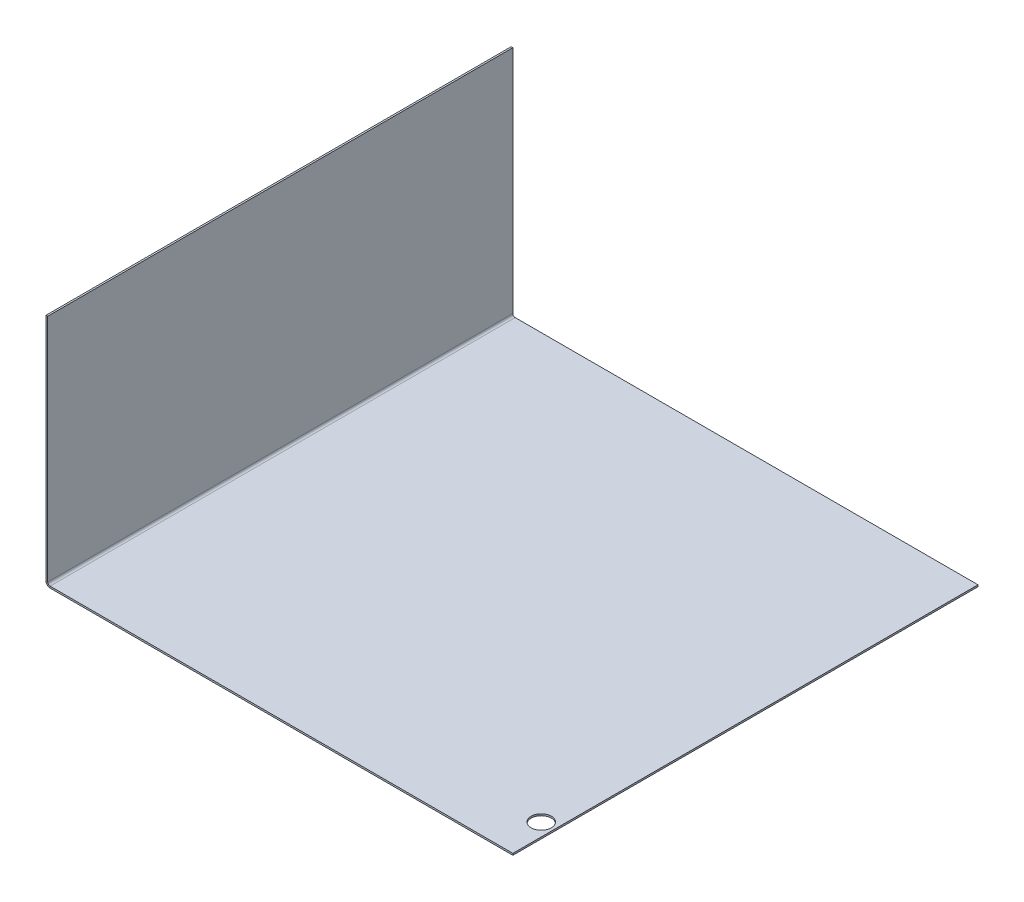
ISO-10303-21;
HEADER;
FILE_DESCRIPTION(('STEP AP214'),'2;1');
FILE_NAME('part.step','',(''),(''),'','','');
FILE_SCHEMA(('AUTOMOTIVE_DESIGN { 1 0 10303 214 1 1 1 1 }'));
ENDSEC;
DATA;
#1=APPLICATION_CONTEXT('core data for automotive mechanical design processes');
#2=APPLICATION_PROTOCOL_DEFINITION('international standard','automotive_design',2000,#1);
#3=PRODUCT_CONTEXT('',#1,'mechanical');
#4=PRODUCT('Part','Part','',(#3));
#5=PRODUCT_RELATED_PRODUCT_CATEGORY('part','',(#4));
#6=PRODUCT_DEFINITION_FORMATION('','',#4);
#7=PRODUCT_DEFINITION_CONTEXT('part definition',#1,'design');
#8=PRODUCT_DEFINITION('design','',#6,#7);
#9=PRODUCT_DEFINITION_SHAPE('','',#8);
#10=(LENGTH_UNIT() NAMED_UNIT(*) SI_UNIT(.MILLI.,.METRE.));
#11=(NAMED_UNIT(*) PLANE_ANGLE_UNIT() SI_UNIT($,.RADIAN.));
#12=(NAMED_UNIT(*) SI_UNIT($,.STERADIAN.) SOLID_ANGLE_UNIT());
#13=UNCERTAINTY_MEASURE_WITH_UNIT(LENGTH_MEASURE(1.E-05),#10,'distance_accuracy_value','');
#14=(GEOMETRIC_REPRESENTATION_CONTEXT(3) GLOBAL_UNCERTAINTY_ASSIGNED_CONTEXT((#13)) GLOBAL_UNIT_ASSIGNED_CONTEXT((#10,
#11,#12)) REPRESENTATION_CONTEXT('',''));
#15=CARTESIAN_POINT('',(0.,0.,0.));
#16=DIRECTION('',(0.,0.,1.));
#17=DIRECTION('',(1.,0.,0.));
#18=AXIS2_PLACEMENT_3D('',#15,#16,#17);
#19=CARTESIAN_POINT('',(1.,0.,100.));
#20=DIRECTION('',(0.,0.,1.));
#21=DIRECTION('',(1.,0.,0.));
#22=AXIS2_PLACEMENT_3D('',#19,#20,#21);
#23=PLANE('',#22);
#24=DIRECTION('',(0.,-1.,0.));
#25=VECTOR('',#24,1.);
#26=CARTESIAN_POINT('',(1.,0.,100.));
#27=LINE('',#26,#25);
#28=CARTESIAN_POINT('',(1.,0.,100.));
#29=VERTEX_POINT('',#28);
#30=CARTESIAN_POINT('',(1.,-0.7366,100.));
#31=VERTEX_POINT('',#30);
#32=EDGE_CURVE('E11',#29,#31,#27,.T.);
#33=ORIENTED_EDGE('',*,*,#32,.F.);
#34=CARTESIAN_POINT('',(1.,1.,100.));
#35=DIRECTION('',(0.,0.,-1.));
#36=DIRECTION('',(-1.,0.,0.));
#37=AXIS2_PLACEMENT_3D('',#34,#35,#36);
#38=CIRCLE('',#37,1.);
#39=CARTESIAN_POINT('',(0.,1.,100.));
#40=VERTEX_POINT('',#39);
#41=EDGE_CURVE('E140',#40,#29,#38,.F.);
#42=ORIENTED_EDGE('',*,*,#41,.F.);
#43=DIRECTION('',(1.,0.,0.));
#44=VECTOR('',#43,1.);
#45=CARTESIAN_POINT('',(-0.7366,1.,100.));
#46=LINE('',#45,#44);
#47=CARTESIAN_POINT('',(-0.7366,1.,100.));
#48=VERTEX_POINT('',#47);
#49=EDGE_CURVE('E51',#48,#40,#46,.T.);
#50=ORIENTED_EDGE('',*,*,#49,.F.);
#51=CARTESIAN_POINT('',(1.,1.,100.));
#52=DIRECTION('',(0.,0.,1.));
#53=DIRECTION('',(1.,0.,0.));
#54=AXIS2_PLACEMENT_3D('',#51,#52,#53);
#55=CIRCLE('',#54,1.7366);
#56=EDGE_CURVE('E133',#48,#31,#55,.T.);
#57=ORIENTED_EDGE('',*,*,#56,.T.);
#58=EDGE_LOOP('',(#33,#42,#50,#57));
#59=FACE_BOUND('',#58,.T.);
#60=ADVANCED_FACE('F43',(#59),#23,.T.);
#61=CARTESIAN_POINT('',(-0.7366,1.,100.));
#62=DIRECTION('',(0.,0.,1.));
#63=DIRECTION('',(1.,0.,0.));
#64=AXIS2_PLACEMENT_3D('',#61,#62,#63);
#65=PLANE('',#64);
#66=DIRECTION('',(1.,0.,0.));
#67=VECTOR('',#66,1.);
#68=CARTESIAN_POINT('',(0.,0.,100.));
#69=LINE('',#68,#67);
#70=CARTESIAN_POINT('',(200.,0.,100.));
#71=VERTEX_POINT('',#70);
#72=EDGE_CURVE('E190',#29,#71,#69,.T.);
#73=ORIENTED_EDGE('',*,*,#72,.F.);
#74=ORIENTED_EDGE('',*,*,#32,.T.);
#75=DIRECTION('',(1.,0.,0.));
#76=VECTOR('',#75,1.);
#77=CARTESIAN_POINT('',(0.,-0.7366,100.));
#78=LINE('',#77,#76);
#79=CARTESIAN_POINT('',(200.,-0.7366,100.));
#80=VERTEX_POINT('',#79);
#81=EDGE_CURVE('E99',#31,#80,#78,.T.);
#82=ORIENTED_EDGE('',*,*,#81,.T.);
#83=DIRECTION('',(0.,-1.,0.));
#84=VECTOR('',#83,1.);
#85=CARTESIAN_POINT('',(200.,0.,100.));
#86=LINE('',#85,#84);
#87=EDGE_CURVE('E366',#71,#80,#86,.T.);
#88=ORIENTED_EDGE('',*,*,#87,.F.);
#89=EDGE_LOOP('',(#73,#74,#82,#88));
#90=FACE_BOUND('',#89,.T.);
#91=ADVANCED_FACE('F198',(#90),#65,.T.);
#92=CARTESIAN_POINT('',(0.,1.,-100.));
#93=DIRECTION('',(0.,0.,-1.));
#94=DIRECTION('',(-1.,0.,0.));
#95=AXIS2_PLACEMENT_3D('',#92,#93,#94);
#96=PLANE('',#95);
#97=DIRECTION('',(-1.,0.,0.));
#98=VECTOR('',#97,1.);
#99=CARTESIAN_POINT('',(0.,1.,-100.));
#100=LINE('',#99,#98);
#101=CARTESIAN_POINT('',(0.,1.,-100.));
#102=VERTEX_POINT('',#101);
#103=CARTESIAN_POINT('',(-0.7366,1.,-100.));
#104=VERTEX_POINT('',#103);
#105=EDGE_CURVE('E86',#102,#104,#100,.T.);
#106=ORIENTED_EDGE('',*,*,#105,.F.);
#107=CARTESIAN_POINT('',(1.,1.,-100.));
#108=DIRECTION('',(0.,0.,-1.));
#109=DIRECTION('',(-1.,0.,0.));
#110=AXIS2_PLACEMENT_3D('',#107,#108,#109);
#111=CIRCLE('',#110,1.);
#112=CARTESIAN_POINT('',(1.,0.,-100.));
#113=VERTEX_POINT('',#112);
#114=EDGE_CURVE('E156',#102,#113,#111,.F.);
#115=ORIENTED_EDGE('',*,*,#114,.T.);
#116=DIRECTION('',(0.,1.,0.));
#117=VECTOR('',#116,1.);
#118=CARTESIAN_POINT('',(1.,-0.7366,-100.));
#119=LINE('',#118,#117);
#120=CARTESIAN_POINT('',(1.,-0.7366,-100.));
#121=VERTEX_POINT('',#120);
#122=EDGE_CURVE('E93',#121,#113,#119,.T.);
#123=ORIENTED_EDGE('',*,*,#122,.F.);
#124=CARTESIAN_POINT('',(1.,1.,-100.));
#125=DIRECTION('',(0.,0.,1.));
#126=DIRECTION('',(1.,0.,0.));
#127=AXIS2_PLACEMENT_3D('',#124,#125,#126);
#128=CIRCLE('',#127,1.7366);
#129=EDGE_CURVE('E163',#104,#121,#128,.T.);
#130=ORIENTED_EDGE('',*,*,#129,.F.);
#131=EDGE_LOOP('',(#106,#115,#123,#130));
#132=FACE_BOUND('',#131,.T.);
#133=ADVANCED_FACE('F196',(#132),#96,.T.);
#134=CARTESIAN_POINT('',(1.,-0.7366,-100.));
#135=DIRECTION('',(0.,0.,-1.));
#136=DIRECTION('',(-1.,0.,0.));
#137=AXIS2_PLACEMENT_3D('',#134,#135,#136);
#138=PLANE('',#137);
#139=DIRECTION('',(0.,-1.,0.));
#140=VECTOR('',#139,1.);
#141=CARTESIAN_POINT('',(0.,100.,-100.));
#142=LINE('',#141,#140);
#143=CARTESIAN_POINT('',(0.,100.,-100.));
#144=VERTEX_POINT('',#143);
#145=EDGE_CURVE('E158',#144,#102,#142,.T.);
#146=ORIENTED_EDGE('',*,*,#145,.T.);
#147=ORIENTED_EDGE('',*,*,#105,.T.);
#148=DIRECTION('',(0.,1.,0.));
#149=VECTOR('',#148,1.);
#150=CARTESIAN_POINT('',(-0.7366,100.,-100.));
#151=LINE('',#150,#149);
#152=CARTESIAN_POINT('',(-0.7366,100.,-100.));
#153=VERTEX_POINT('',#152);
#154=EDGE_CURVE('E161',#153,#104,#151,.F.);
#155=ORIENTED_EDGE('',*,*,#154,.F.);
#156=DIRECTION('',(1.,0.,0.));
#157=VECTOR('',#156,1.);
#158=CARTESIAN_POINT('',(-0.7366,100.,-100.));
#159=LINE('',#158,#157);
#160=EDGE_CURVE('E121',#153,#144,#159,.T.);
#161=ORIENTED_EDGE('',*,*,#160,.T.);
#162=EDGE_LOOP('',(#146,#147,#155,#161));
#163=FACE_BOUND('',#162,.T.);
#164=ADVANCED_FACE('F192',(#163),#138,.T.);
#165=CARTESIAN_POINT('',(0.,-0.7366,100.));
#166=DIRECTION('',(0.,1.,0.));
#167=DIRECTION('',(0.,0.,1.));
#168=AXIS2_PLACEMENT_3D('',#165,#166,#167);
#169=PLANE('',#168);
#170=CARTESIAN_POINT('',(194.445286261705,-0.7366,82.2169240869359));
#171=DIRECTION('',(0.,1.,0.));
#172=DIRECTION('',(0.,0.,1.));
#173=AXIS2_PLACEMENT_3D('',#170,#171,#172);
#174=CIRCLE('',#173,4.33433537196366);
#175=CARTESIAN_POINT('',(194.445286261705,-0.7366,86.5512594588995));
#176=VERTEX_POINT('',#175);
#177=EDGE_CURVE('E150',#176,#176,#174,.T.);
#178=ORIENTED_EDGE('',*,*,#177,.T.);
#179=EDGE_LOOP('',(#178));
#180=FACE_BOUND('',#179,.T.);
#181=DIRECTION('',(1.,0.,0.));
#182=VECTOR('',#181,1.);
#183=CARTESIAN_POINT('',(0.,-0.7366,-100.));
#184=LINE('',#183,#182);
#185=CARTESIAN_POINT('',(200.,-0.7366,-100.));
#186=VERTEX_POINT('',#185);
#187=EDGE_CURVE('E146',#121,#186,#184,.T.);
#188=ORIENTED_EDGE('',*,*,#187,.T.);
#189=DIRECTION('',(0.,0.,-1.));
#190=VECTOR('',#189,1.);
#191=CARTESIAN_POINT('',(200.,-0.7366,100.));
#192=LINE('',#191,#190);
#193=EDGE_CURVE('E177',#80,#186,#192,.T.);
#194=ORIENTED_EDGE('',*,*,#193,.F.);
#195=ORIENTED_EDGE('',*,*,#81,.F.);
#196=DIRECTION('',(0.,0.,-1.));
#197=VECTOR('',#196,1.);
#198=CARTESIAN_POINT('',(1.,-0.7366,100.));
#199=LINE('',#198,#197);
#200=EDGE_CURVE('E145',#31,#121,#199,.T.);
#201=ORIENTED_EDGE('',*,*,#200,.T.);
#202=EDGE_LOOP('',(#188,#194,#195,#201));
#203=FACE_BOUND('',#202,.T.);
#204=ADVANCED_FACE('F204',(#180,#203),#169,.F.);
#205=CARTESIAN_POINT('',(200.,0.,100.));
#206=DIRECTION('',(1.,0.,0.));
#207=DIRECTION('',(0.,0.,-1.));
#208=AXIS2_PLACEMENT_3D('',#205,#206,#207);
#209=PLANE('',#208);
#210=DIRECTION('',(0.,-1.,0.));
#211=VECTOR('',#210,1.);
#212=CARTESIAN_POINT('',(200.,0.,-100.));
#213=LINE('',#212,#211);
#214=CARTESIAN_POINT('',(200.,0.,-100.));
#215=VERTEX_POINT('',#214);
#216=EDGE_CURVE('E149',#215,#186,#213,.T.);
#217=ORIENTED_EDGE('',*,*,#216,.F.);
#218=DIRECTION('',(0.,0.,-1.));
#219=VECTOR('',#218,1.);
#220=CARTESIAN_POINT('',(200.,0.,100.));
#221=LINE('',#220,#219);
#222=EDGE_CURVE('E175',#71,#215,#221,.T.);
#223=ORIENTED_EDGE('',*,*,#222,.F.);
#224=ORIENTED_EDGE('',*,*,#87,.T.);
#225=ORIENTED_EDGE('',*,*,#193,.T.);
#226=EDGE_LOOP('',(#217,#223,#224,#225));
#227=FACE_BOUND('',#226,.T.);
#228=ADVANCED_FACE('F238',(#227),#209,.T.);
#229=CARTESIAN_POINT('',(0.,0.,100.));
#230=DIRECTION('',(0.,1.,0.));
#231=DIRECTION('',(0.,0.,1.));
#232=AXIS2_PLACEMENT_3D('',#229,#230,#231);
#233=PLANE('',#232);
#234=CARTESIAN_POINT('',(194.445286261705,0.,82.2169240869359));
#235=DIRECTION('',(0.,1.,0.));
#236=DIRECTION('',(0.,0.,1.));
#237=AXIS2_PLACEMENT_3D('',#234,#235,#236);
#238=CIRCLE('',#237,4.33433537196366);
#239=CARTESIAN_POINT('',(194.445286261705,0.,86.5512594588995));
#240=VERTEX_POINT('',#239);
#241=EDGE_CURVE('E361',#240,#240,#238,.T.);
#242=ORIENTED_EDGE('',*,*,#241,.F.);
#243=EDGE_LOOP('',(#242));
#244=FACE_BOUND('',#243,.T.);
#245=DIRECTION('',(1.,0.,0.));
#246=VECTOR('',#245,1.);
#247=CARTESIAN_POINT('',(0.,0.,-100.));
#248=LINE('',#247,#246);
#249=EDGE_CURVE('E153',#113,#215,#248,.T.);
#250=ORIENTED_EDGE('',*,*,#249,.F.);
#251=DIRECTION('',(0.,0.,-1.));
#252=VECTOR('',#251,1.);
#253=CARTESIAN_POINT('',(1.,0.,100.));
#254=LINE('',#253,#252);
#255=EDGE_CURVE('E172',#29,#113,#254,.T.);
#256=ORIENTED_EDGE('',*,*,#255,.F.);
#257=ORIENTED_EDGE('',*,*,#72,.T.);
#258=ORIENTED_EDGE('',*,*,#222,.T.);
#259=EDGE_LOOP('',(#250,#256,#257,#258));
#260=FACE_BOUND('',#259,.T.);
#261=ADVANCED_FACE('F250',(#244,#260),#233,.T.);
#262=CARTESIAN_POINT('',(1.,1.,100.));
#263=DIRECTION('',(0.,0.,-1.));
#264=DIRECTION('',(-1.,0.,0.));
#265=AXIS2_PLACEMENT_3D('',#262,#263,#264);
#266=CYLINDRICAL_SURFACE('',#265,1.);
#267=ORIENTED_EDGE('',*,*,#114,.F.);
#268=DIRECTION('',(0.,0.,-1.));
#269=VECTOR('',#268,1.);
#270=CARTESIAN_POINT('',(0.,1.,100.));
#271=LINE('',#270,#269);
#272=EDGE_CURVE('E169',#40,#102,#271,.T.);
#273=ORIENTED_EDGE('',*,*,#272,.F.);
#274=ORIENTED_EDGE('',*,*,#41,.T.);
#275=ORIENTED_EDGE('',*,*,#255,.T.);
#276=EDGE_LOOP('',(#267,#273,#274,#275));
#277=FACE_BOUND('',#276,.T.);
#278=ADVANCED_FACE('F186',(#277),#266,.F.);
#279=CARTESIAN_POINT('',(0.,100.,100.));
#280=DIRECTION('',(1.,0.,0.));
#281=DIRECTION('',(0.,0.,-1.));
#282=AXIS2_PLACEMENT_3D('',#279,#280,#281);
#283=PLANE('',#282);
#284=ORIENTED_EDGE('',*,*,#145,.F.);
#285=DIRECTION('',(0.,0.,-1.));
#286=VECTOR('',#285,1.);
#287=CARTESIAN_POINT('',(0.,100.,100.));
#288=LINE('',#287,#286);
#289=CARTESIAN_POINT('',(0.,100.,100.));
#290=VERTEX_POINT('',#289);
#291=EDGE_CURVE('E123',#290,#144,#288,.T.);
#292=ORIENTED_EDGE('',*,*,#291,.F.);
#293=DIRECTION('',(0.,-1.,0.));
#294=VECTOR('',#293,1.);
#295=CARTESIAN_POINT('',(0.,100.,100.));
#296=LINE('',#295,#294);
#297=EDGE_CURVE('E138',#290,#40,#296,.T.);
#298=ORIENTED_EDGE('',*,*,#297,.T.);
#299=ORIENTED_EDGE('',*,*,#272,.T.);
#300=EDGE_LOOP('',(#284,#292,#298,#299));
#301=FACE_BOUND('',#300,.T.);
#302=ADVANCED_FACE('F191',(#301),#283,.T.);
#303=CARTESIAN_POINT('',(-0.7366,100.,100.));
#304=DIRECTION('',(0.,1.,0.));
#305=DIRECTION('',(0.,0.,1.));
#306=AXIS2_PLACEMENT_3D('',#303,#304,#305);
#307=PLANE('',#306);
#308=ORIENTED_EDGE('',*,*,#160,.F.);
#309=DIRECTION('',(0.,0.,-1.));
#310=VECTOR('',#309,1.);
#311=CARTESIAN_POINT('',(-0.7366,100.,100.));
#312=LINE('',#311,#310);
#313=CARTESIAN_POINT('',(-0.7366,100.,100.));
#314=VERTEX_POINT('',#313);
#315=EDGE_CURVE('E115',#314,#153,#312,.T.);
#316=ORIENTED_EDGE('',*,*,#315,.F.);
#317=DIRECTION('',(1.,0.,0.));
#318=VECTOR('',#317,1.);
#319=CARTESIAN_POINT('',(-0.7366,100.,100.));
#320=LINE('',#319,#318);
#321=EDGE_CURVE('E119',#314,#290,#320,.T.);
#322=ORIENTED_EDGE('',*,*,#321,.T.);
#323=ORIENTED_EDGE('',*,*,#291,.T.);
#324=EDGE_LOOP('',(#308,#316,#322,#323));
#325=FACE_BOUND('',#324,.T.);
#326=ADVANCED_FACE('F117',(#325),#307,.T.);
#327=CARTESIAN_POINT('',(-0.7366,100.,100.));
#328=DIRECTION('',(1.,0.,0.));
#329=DIRECTION('',(0.,0.,-1.));
#330=AXIS2_PLACEMENT_3D('',#327,#328,#329);
#331=PLANE('',#330);
#332=ORIENTED_EDGE('',*,*,#154,.T.);
#333=DIRECTION('',(0.,0.,-1.));
#334=VECTOR('',#333,1.);
#335=CARTESIAN_POINT('',(-0.7366,1.,100.));
#336=LINE('',#335,#334);
#337=EDGE_CURVE('E124',#48,#104,#336,.T.);
#338=ORIENTED_EDGE('',*,*,#337,.F.);
#339=DIRECTION('',(0.,1.,0.));
#340=VECTOR('',#339,1.);
#341=CARTESIAN_POINT('',(-0.7366,100.,100.));
#342=LINE('',#341,#340);
#343=EDGE_CURVE('E128',#314,#48,#342,.F.);
#344=ORIENTED_EDGE('',*,*,#343,.F.);
#345=ORIENTED_EDGE('',*,*,#315,.T.);
#346=EDGE_LOOP('',(#332,#338,#344,#345));
#347=FACE_BOUND('',#346,.T.);
#348=ADVANCED_FACE('F129',(#347),#331,.F.);
#349=CARTESIAN_POINT('',(1.,1.,100.));
#350=DIRECTION('',(0.,0.,-1.));
#351=DIRECTION('',(-1.,0.,0.));
#352=AXIS2_PLACEMENT_3D('',#349,#350,#351);
#353=CYLINDRICAL_SURFACE('',#352,1.7366);
#354=ORIENTED_EDGE('',*,*,#129,.T.);
#355=ORIENTED_EDGE('',*,*,#200,.F.);
#356=ORIENTED_EDGE('',*,*,#56,.F.);
#357=ORIENTED_EDGE('',*,*,#337,.T.);
#358=EDGE_LOOP('',(#354,#355,#356,#357));
#359=FACE_BOUND('',#358,.T.);
#360=ADVANCED_FACE('F194',(#359),#353,.T.);
#361=CARTESIAN_POINT('',(1.,1.,100.));
#362=DIRECTION('',(0.,0.,-1.));
#363=DIRECTION('',(-1.,0.,0.));
#364=AXIS2_PLACEMENT_3D('',#361,#362,#363);
#365=PLANE('',#364);
#366=ORIENTED_EDGE('',*,*,#343,.T.);
#367=ORIENTED_EDGE('',*,*,#49,.T.);
#368=ORIENTED_EDGE('',*,*,#297,.F.);
#369=ORIENTED_EDGE('',*,*,#321,.F.);
#370=EDGE_LOOP('',(#366,#367,#368,#369));
#371=FACE_BOUND('',#370,.T.);
#372=ADVANCED_FACE('F136',(#371),#365,.F.);
#373=CARTESIAN_POINT('',(1.,1.,-100.));
#374=DIRECTION('',(0.,0.,-1.));
#375=DIRECTION('',(-1.,0.,0.));
#376=AXIS2_PLACEMENT_3D('',#373,#374,#375);
#377=PLANE('',#376);
#378=ORIENTED_EDGE('',*,*,#187,.F.);
#379=ORIENTED_EDGE('',*,*,#122,.T.);
#380=ORIENTED_EDGE('',*,*,#249,.T.);
#381=ORIENTED_EDGE('',*,*,#216,.T.);
#382=EDGE_LOOP('',(#378,#379,#380,#381));
#383=FACE_BOUND('',#382,.T.);
#384=ADVANCED_FACE('F316',(#383),#377,.T.);
#385=CARTESIAN_POINT('',(194.445286261705,-0.7366,82.2169240869359));
#386=DIRECTION('',(0.,1.,0.));
#387=DIRECTION('',(0.,0.,1.));
#388=AXIS2_PLACEMENT_3D('',#385,#386,#387);
#389=CYLINDRICAL_SURFACE('',#388,4.33433537196366);
#390=ORIENTED_EDGE('',*,*,#177,.F.);
#391=EDGE_LOOP('',(#390));
#392=FACE_BOUND('',#391,.T.);
#393=ORIENTED_EDGE('',*,*,#241,.T.);
#394=EDGE_LOOP('',(#393));
#395=FACE_BOUND('',#394,.T.);
#396=ADVANCED_FACE('F325',(#392,#395),#389,.F.);
#397=CLOSED_SHELL('',(#60,#91,#133,#164,#204,#228,#261,#278,#302,#326,#348,#360,#372,#384,#396));
#398=MANIFOLD_SOLID_BREP('B2',#397);
#399=ADVANCED_BREP_SHAPE_REPRESENTATION('',(#18,#398),#14);
#400=SHAPE_DEFINITION_REPRESENTATION(#9,#399);
ENDSEC;
END-ISO-10303-21;
